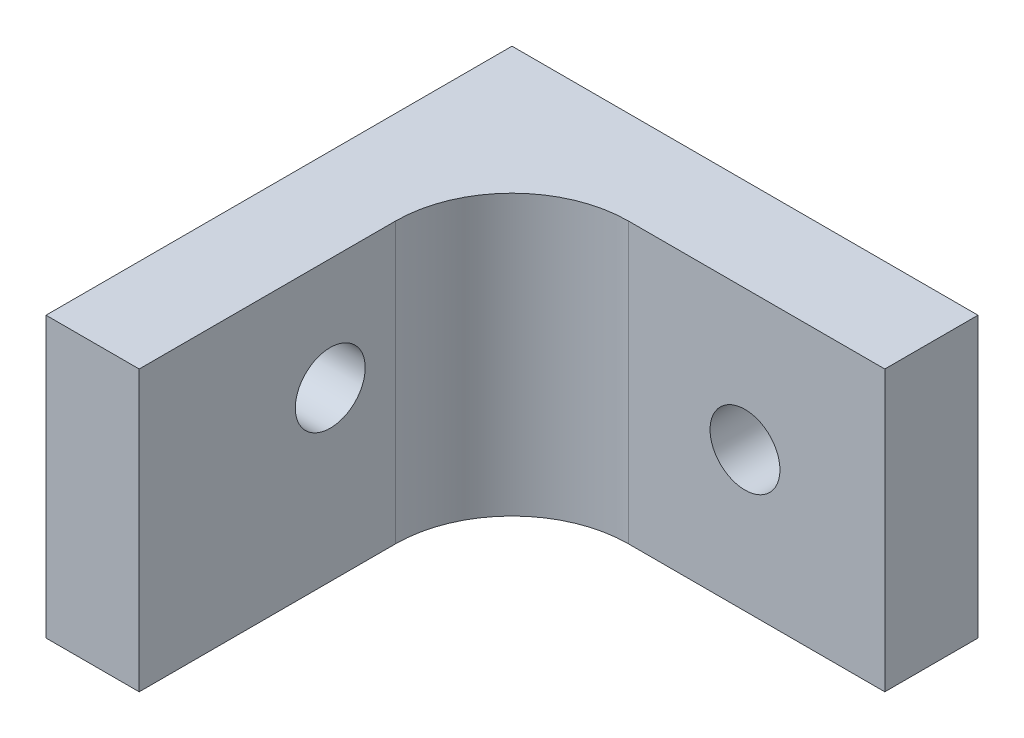
ISO-10303-21;
HEADER;
FILE_DESCRIPTION(('STEP AP214'),'2;1');
FILE_NAME('part.step','',(''),(''),'','','');
FILE_SCHEMA(('AUTOMOTIVE_DESIGN { 1 0 10303 214 1 1 1 1 }'));
ENDSEC;
DATA;
#1=APPLICATION_CONTEXT('core data for automotive mechanical design processes');
#2=APPLICATION_PROTOCOL_DEFINITION('international standard','automotive_design',2000,#1);
#3=PRODUCT_CONTEXT('',#1,'mechanical');
#4=PRODUCT('Part','Part','',(#3));
#5=PRODUCT_RELATED_PRODUCT_CATEGORY('part','',(#4));
#6=PRODUCT_DEFINITION_FORMATION('','',#4);
#7=PRODUCT_DEFINITION_CONTEXT('part definition',#1,'design');
#8=PRODUCT_DEFINITION('design','',#6,#7);
#9=PRODUCT_DEFINITION_SHAPE('','',#8);
#10=(LENGTH_UNIT() NAMED_UNIT(*) SI_UNIT(.MILLI.,.METRE.));
#11=(NAMED_UNIT(*) PLANE_ANGLE_UNIT() SI_UNIT($,.RADIAN.));
#12=(NAMED_UNIT(*) SI_UNIT($,.STERADIAN.) SOLID_ANGLE_UNIT());
#13=UNCERTAINTY_MEASURE_WITH_UNIT(LENGTH_MEASURE(1.E-05),#10,'distance_accuracy_value','');
#14=(GEOMETRIC_REPRESENTATION_CONTEXT(3) GLOBAL_UNCERTAINTY_ASSIGNED_CONTEXT((#13)) GLOBAL_UNIT_ASSIGNED_CONTEXT((#10,
#11,#12)) REPRESENTATION_CONTEXT('',''));
#15=CARTESIAN_POINT('',(0.,0.,0.));
#16=DIRECTION('',(0.,0.,1.));
#17=DIRECTION('',(1.,0.,0.));
#18=AXIS2_PLACEMENT_3D('',#15,#16,#17);
#19=CARTESIAN_POINT('',(0.,0.,2.));
#20=DIRECTION('',(0.,0.,1.));
#21=DIRECTION('',(1.,0.,0.));
#22=AXIS2_PLACEMENT_3D('',#19,#20,#21);
#23=PLANE('',#22);
#24=CARTESIAN_POINT('',(-3.,-3.,2.));
#25=DIRECTION('',(0.,0.,1.));
#26=DIRECTION('',(1.,0.,0.));
#27=AXIS2_PLACEMENT_3D('',#24,#25,#26);
#28=CIRCLE('',#27,0.75);
#29=CARTESIAN_POINT('',(-2.25,-3.,2.));
#30=VERTEX_POINT('',#29);
#31=EDGE_CURVE('E124',#30,#30,#28,.T.);
#32=ORIENTED_EDGE('',*,*,#31,.F.);
#33=EDGE_LOOP('',(#32));
#34=FACE_BOUND('',#33,.T.);
#35=DIRECTION('',(-1.,0.,0.));
#36=VECTOR('',#35,1.);
#37=CARTESIAN_POINT('',(0.,0.,2.));
#38=LINE('',#37,#36);
#39=CARTESIAN_POINT('',(0.,0.,2.));
#40=VERTEX_POINT('',#39);
#41=CARTESIAN_POINT('',(-5.5,0.,2.));
#42=VERTEX_POINT('',#41);
#43=EDGE_CURVE('E135',#40,#42,#38,.T.);
#44=ORIENTED_EDGE('',*,*,#43,.T.);
#45=DIRECTION('',(0.,-1.,0.));
#46=VECTOR('',#45,1.);
#47=CARTESIAN_POINT('',(-5.5,0.,2.));
#48=LINE('',#47,#46);
#49=CARTESIAN_POINT('',(-5.5,-6.00000000000001,2.));
#50=VERTEX_POINT('',#49);
#51=EDGE_CURVE('E158',#42,#50,#48,.T.);
#52=ORIENTED_EDGE('',*,*,#51,.T.);
#53=DIRECTION('',(1.,0.,0.));
#54=VECTOR('',#53,1.);
#55=CARTESIAN_POINT('',(0.,-6.00000000000001,2.));
#56=LINE('',#55,#54);
#57=CARTESIAN_POINT('',(0.,-6.00000000000001,2.));
#58=VERTEX_POINT('',#57);
#59=EDGE_CURVE('E138',#50,#58,#56,.T.);
#60=ORIENTED_EDGE('',*,*,#59,.T.);
#61=DIRECTION('',(0.,1.,0.));
#62=VECTOR('',#61,1.);
#63=CARTESIAN_POINT('',(0.,-6.00000000000001,2.));
#64=LINE('',#63,#62);
#65=EDGE_CURVE('E126',#58,#40,#64,.T.);
#66=ORIENTED_EDGE('',*,*,#65,.T.);
#67=EDGE_LOOP('',(#44,#52,#60,#66));
#68=FACE_BOUND('',#67,.T.);
#69=ADVANCED_FACE('F39',(#34,#68),#23,.T.);
#70=CARTESIAN_POINT('',(0.,0.,0.));
#71=DIRECTION('',(0.,0.,1.));
#72=DIRECTION('',(1.,0.,0.));
#73=AXIS2_PLACEMENT_3D('',#70,#71,#72);
#74=PLANE('',#73);
#75=DIRECTION('',(0.,-1.,0.));
#76=VECTOR('',#75,1.);
#77=CARTESIAN_POINT('',(-10.,-6.00000000000001,0.));
#78=LINE('',#77,#76);
#79=CARTESIAN_POINT('',(-10.,0.,0.));
#80=VERTEX_POINT('',#79);
#81=CARTESIAN_POINT('',(-10.,-6.00000000000001,0.));
#82=VERTEX_POINT('',#81);
#83=EDGE_CURVE('E141',#80,#82,#78,.T.);
#84=ORIENTED_EDGE('',*,*,#83,.F.);
#85=DIRECTION('',(-1.,0.,0.));
#86=VECTOR('',#85,1.);
#87=CARTESIAN_POINT('',(0.,0.,0.));
#88=LINE('',#87,#86);
#89=CARTESIAN_POINT('',(0.,0.,0.));
#90=VERTEX_POINT('',#89);
#91=EDGE_CURVE('E142',#90,#80,#88,.T.);
#92=ORIENTED_EDGE('',*,*,#91,.F.);
#93=DIRECTION('',(0.,1.,0.));
#94=VECTOR('',#93,1.);
#95=CARTESIAN_POINT('',(0.,-6.00000000000001,0.));
#96=LINE('',#95,#94);
#97=CARTESIAN_POINT('',(0.,-6.00000000000001,0.));
#98=VERTEX_POINT('',#97);
#99=EDGE_CURVE('E127',#98,#90,#96,.T.);
#100=ORIENTED_EDGE('',*,*,#99,.F.);
#101=DIRECTION('',(1.,0.,0.));
#102=VECTOR('',#101,1.);
#103=CARTESIAN_POINT('',(0.,-6.00000000000001,0.));
#104=LINE('',#103,#102);
#105=EDGE_CURVE('E134',#82,#98,#104,.T.);
#106=ORIENTED_EDGE('',*,*,#105,.F.);
#107=EDGE_LOOP('',(#84,#92,#100,#106));
#108=FACE_BOUND('',#107,.T.);
#109=CARTESIAN_POINT('',(-3.,-3.,0.));
#110=DIRECTION('',(0.,0.,1.));
#111=DIRECTION('',(1.,0.,0.));
#112=AXIS2_PLACEMENT_3D('',#109,#110,#111);
#113=CIRCLE('',#112,0.75);
#114=CARTESIAN_POINT('',(-2.25,-3.,0.));
#115=VERTEX_POINT('',#114);
#116=EDGE_CURVE('E122',#115,#115,#113,.T.);
#117=ORIENTED_EDGE('',*,*,#116,.T.);
#118=EDGE_LOOP('',(#117));
#119=FACE_BOUND('',#118,.T.);
#120=ADVANCED_FACE('F181',(#108,#119),#74,.F.);
#121=CARTESIAN_POINT('',(0.,-6.00000000000001,2.));
#122=DIRECTION('',(-1.,0.,0.));
#123=DIRECTION('',(0.,-1.,0.));
#124=AXIS2_PLACEMENT_3D('',#121,#122,#123);
#125=PLANE('',#124);
#126=ORIENTED_EDGE('',*,*,#99,.T.);
#127=DIRECTION('',(0.,0.,-1.));
#128=VECTOR('',#127,1.);
#129=CARTESIAN_POINT('',(0.,0.,2.));
#130=LINE('',#129,#128);
#131=EDGE_CURVE('E154',#40,#90,#130,.T.);
#132=ORIENTED_EDGE('',*,*,#131,.F.);
#133=ORIENTED_EDGE('',*,*,#65,.F.);
#134=DIRECTION('',(0.,0.,-1.));
#135=VECTOR('',#134,1.);
#136=CARTESIAN_POINT('',(0.,-6.00000000000001,2.));
#137=LINE('',#136,#135);
#138=EDGE_CURVE('E137',#58,#98,#137,.T.);
#139=ORIENTED_EDGE('',*,*,#138,.T.);
#140=EDGE_LOOP('',(#126,#132,#133,#139));
#141=FACE_BOUND('',#140,.T.);
#142=ADVANCED_FACE('F169',(#141),#125,.F.);
#143=CARTESIAN_POINT('',(0.,0.,2.));
#144=DIRECTION('',(0.,-1.,0.));
#145=DIRECTION('',(0.,0.,-1.));
#146=AXIS2_PLACEMENT_3D('',#143,#144,#145);
#147=PLANE('',#146);
#148=DIRECTION('',(0.,0.,-1.));
#149=VECTOR('',#148,1.);
#150=CARTESIAN_POINT('',(-10.,0.,2.));
#151=LINE('',#150,#149);
#152=CARTESIAN_POINT('',(-10.,0.,10.));
#153=VERTEX_POINT('',#152);
#154=EDGE_CURVE('E148',#153,#80,#151,.T.);
#155=ORIENTED_EDGE('',*,*,#154,.F.);
#156=DIRECTION('',(-1.,0.,0.));
#157=VECTOR('',#156,1.);
#158=CARTESIAN_POINT('',(-8.,0.,10.));
#159=LINE('',#158,#157);
#160=CARTESIAN_POINT('',(-8.,0.,10.));
#161=VERTEX_POINT('',#160);
#162=EDGE_CURVE('E109',#161,#153,#159,.T.);
#163=ORIENTED_EDGE('',*,*,#162,.F.);
#164=DIRECTION('',(0.,0.,-1.));
#165=VECTOR('',#164,1.);
#166=CARTESIAN_POINT('',(-8.,0.,0.));
#167=LINE('',#166,#165);
#168=CARTESIAN_POINT('',(-8.,0.,4.5));
#169=VERTEX_POINT('',#168);
#170=EDGE_CURVE('E111',#161,#169,#167,.T.);
#171=ORIENTED_EDGE('',*,*,#170,.T.);
#172=CARTESIAN_POINT('',(-5.5,0.,4.5));
#173=DIRECTION('',(0.,-1.,0.));
#174=DIRECTION('',(0.,0.,-1.));
#175=AXIS2_PLACEMENT_3D('',#172,#173,#174);
#176=CIRCLE('',#175,2.5);
#177=EDGE_CURVE('E11',#169,#42,#176,.T.);
#178=ORIENTED_EDGE('',*,*,#177,.T.);
#179=ORIENTED_EDGE('',*,*,#43,.F.);
#180=ORIENTED_EDGE('',*,*,#131,.T.);
#181=ORIENTED_EDGE('',*,*,#91,.T.);
#182=EDGE_LOOP('',(#155,#163,#171,#178,#179,#180,#181));
#183=FACE_BOUND('',#182,.T.);
#184=ADVANCED_FACE('F171',(#183),#147,.F.);
#185=CARTESIAN_POINT('',(-10.,-6.00000000000001,2.));
#186=DIRECTION('',(1.,0.,0.));
#187=DIRECTION('',(0.,0.,-1.));
#188=AXIS2_PLACEMENT_3D('',#185,#186,#187);
#189=PLANE('',#188);
#190=ORIENTED_EDGE('',*,*,#83,.T.);
#191=DIRECTION('',(0.,0.,-1.));
#192=VECTOR('',#191,1.);
#193=CARTESIAN_POINT('',(-10.,-6.00000000000001,2.));
#194=LINE('',#193,#192);
#195=CARTESIAN_POINT('',(-10.,-6.,10.));
#196=VERTEX_POINT('',#195);
#197=EDGE_CURVE('E149',#196,#82,#194,.T.);
#198=ORIENTED_EDGE('',*,*,#197,.F.);
#199=DIRECTION('',(0.,1.,0.));
#200=VECTOR('',#199,1.);
#201=CARTESIAN_POINT('',(-10.,0.,10.));
#202=LINE('',#201,#200);
#203=EDGE_CURVE('E101',#196,#153,#202,.T.);
#204=ORIENTED_EDGE('',*,*,#203,.T.);
#205=ORIENTED_EDGE('',*,*,#154,.T.);
#206=EDGE_LOOP('',(#190,#198,#204,#205));
#207=FACE_BOUND('',#206,.T.);
#208=CARTESIAN_POINT('',(-10.,-2.4,5.90000000000007));
#209=DIRECTION('',(-1.,0.,0.));
#210=DIRECTION('',(0.,0.,1.));
#211=AXIS2_PLACEMENT_3D('',#208,#209,#210);
#212=CIRCLE('',#211,0.75);
#213=CARTESIAN_POINT('',(-10.,-2.4,6.65000000000007));
#214=VERTEX_POINT('',#213);
#215=EDGE_CURVE('E281',#214,#214,#212,.T.);
#216=ORIENTED_EDGE('',*,*,#215,.F.);
#217=EDGE_LOOP('',(#216));
#218=FACE_BOUND('',#217,.T.);
#219=ADVANCED_FACE('F200',(#207,#218),#189,.F.);
#220=CARTESIAN_POINT('',(0.,-6.00000000000001,2.));
#221=DIRECTION('',(0.,1.,0.));
#222=DIRECTION('',(0.,0.,1.));
#223=AXIS2_PLACEMENT_3D('',#220,#221,#222);
#224=PLANE('',#223);
#225=ORIENTED_EDGE('',*,*,#105,.T.);
#226=ORIENTED_EDGE('',*,*,#138,.F.);
#227=ORIENTED_EDGE('',*,*,#59,.F.);
#228=CARTESIAN_POINT('',(-5.5,-6.00000000000001,4.5));
#229=DIRECTION('',(0.,1.,0.));
#230=DIRECTION('',(0.,0.,1.));
#231=AXIS2_PLACEMENT_3D('',#228,#229,#230);
#232=CIRCLE('',#231,2.5);
#233=CARTESIAN_POINT('',(-8.,-6.,4.5));
#234=VERTEX_POINT('',#233);
#235=EDGE_CURVE('E50',#50,#234,#232,.T.);
#236=ORIENTED_EDGE('',*,*,#235,.T.);
#237=DIRECTION('',(0.,0.,1.));
#238=VECTOR('',#237,1.);
#239=CARTESIAN_POINT('',(-8.,-6.,0.));
#240=LINE('',#239,#238);
#241=CARTESIAN_POINT('',(-8.,-6.,10.));
#242=VERTEX_POINT('',#241);
#243=EDGE_CURVE('E91',#234,#242,#240,.T.);
#244=ORIENTED_EDGE('',*,*,#243,.T.);
#245=DIRECTION('',(-1.,0.,0.));
#246=VECTOR('',#245,1.);
#247=CARTESIAN_POINT('',(-8.,-6.,10.));
#248=LINE('',#247,#246);
#249=EDGE_CURVE('E100',#242,#196,#248,.T.);
#250=ORIENTED_EDGE('',*,*,#249,.T.);
#251=ORIENTED_EDGE('',*,*,#197,.T.);
#252=EDGE_LOOP('',(#225,#226,#227,#236,#244,#250,#251));
#253=FACE_BOUND('',#252,.T.);
#254=ADVANCED_FACE('F97',(#253),#224,.F.);
#255=CARTESIAN_POINT('',(-3.,-3.,2.));
#256=DIRECTION('',(0.,0.,-1.));
#257=DIRECTION('',(-1.,0.,0.));
#258=AXIS2_PLACEMENT_3D('',#255,#256,#257);
#259=CYLINDRICAL_SURFACE('',#258,0.75);
#260=ORIENTED_EDGE('',*,*,#31,.T.);
#261=EDGE_LOOP('',(#260));
#262=FACE_BOUND('',#261,.T.);
#263=ORIENTED_EDGE('',*,*,#116,.F.);
#264=EDGE_LOOP('',(#263));
#265=FACE_BOUND('',#264,.T.);
#266=ADVANCED_FACE('F195',(#262,#265),#259,.F.);
#267=CARTESIAN_POINT('',(-8.,0.,10.));
#268=DIRECTION('',(0.,0.,1.));
#269=DIRECTION('',(1.,0.,0.));
#270=AXIS2_PLACEMENT_3D('',#267,#268,#269);
#271=PLANE('',#270);
#272=ORIENTED_EDGE('',*,*,#203,.F.);
#273=ORIENTED_EDGE('',*,*,#249,.F.);
#274=DIRECTION('',(0.,1.,0.));
#275=VECTOR('',#274,1.);
#276=CARTESIAN_POINT('',(-8.,0.,10.));
#277=LINE('',#276,#275);
#278=EDGE_CURVE('E105',#242,#161,#277,.T.);
#279=ORIENTED_EDGE('',*,*,#278,.T.);
#280=ORIENTED_EDGE('',*,*,#162,.T.);
#281=EDGE_LOOP('',(#272,#273,#279,#280));
#282=FACE_BOUND('',#281,.T.);
#283=ADVANCED_FACE('F110',(#282),#271,.T.);
#284=CARTESIAN_POINT('',(-8.,0.,0.));
#285=DIRECTION('',(-1.,0.,0.));
#286=DIRECTION('',(0.,0.,1.));
#287=AXIS2_PLACEMENT_3D('',#284,#285,#286);
#288=PLANE('',#287);
#289=ORIENTED_EDGE('',*,*,#243,.F.);
#290=DIRECTION('',(0.,-1.,0.));
#291=VECTOR('',#290,1.);
#292=CARTESIAN_POINT('',(-8.,0.,4.5));
#293=LINE('',#292,#291);
#294=EDGE_CURVE('E58',#234,#169,#293,.F.);
#295=ORIENTED_EDGE('',*,*,#294,.T.);
#296=ORIENTED_EDGE('',*,*,#170,.F.);
#297=ORIENTED_EDGE('',*,*,#278,.F.);
#298=EDGE_LOOP('',(#289,#295,#296,#297));
#299=FACE_BOUND('',#298,.T.);
#300=CARTESIAN_POINT('',(-8.,-2.4,5.90000000000007));
#301=DIRECTION('',(-1.,0.,0.));
#302=DIRECTION('',(0.,0.,1.));
#303=AXIS2_PLACEMENT_3D('',#300,#301,#302);
#304=CIRCLE('',#303,0.75);
#305=CARTESIAN_POINT('',(-8.,-2.4,6.65000000000007));
#306=VERTEX_POINT('',#305);
#307=EDGE_CURVE('E119',#306,#306,#304,.T.);
#308=ORIENTED_EDGE('',*,*,#307,.T.);
#309=EDGE_LOOP('',(#308));
#310=FACE_BOUND('',#309,.T.);
#311=ADVANCED_FACE('F113',(#299,#310),#288,.F.);
#312=CARTESIAN_POINT('',(-8.,-2.4,5.90000000000007));
#313=DIRECTION('',(-1.,0.,0.));
#314=DIRECTION('',(0.,0.,1.));
#315=AXIS2_PLACEMENT_3D('',#312,#313,#314);
#316=CYLINDRICAL_SURFACE('',#315,0.75);
#317=ORIENTED_EDGE('',*,*,#307,.F.);
#318=EDGE_LOOP('',(#317));
#319=FACE_BOUND('',#318,.T.);
#320=ORIENTED_EDGE('',*,*,#215,.T.);
#321=EDGE_LOOP('',(#320));
#322=FACE_BOUND('',#321,.T.);
#323=ADVANCED_FACE('F173',(#319,#322),#316,.F.);
#324=CARTESIAN_POINT('',(-5.5,0.,4.5));
#325=DIRECTION('',(0.,-1.,0.));
#326=DIRECTION('',(0.,0.,-1.));
#327=AXIS2_PLACEMENT_3D('',#324,#325,#326);
#328=CYLINDRICAL_SURFACE('',#327,2.5);
#329=ORIENTED_EDGE('',*,*,#177,.F.);
#330=ORIENTED_EDGE('',*,*,#294,.F.);
#331=ORIENTED_EDGE('',*,*,#235,.F.);
#332=ORIENTED_EDGE('',*,*,#51,.F.);
#333=EDGE_LOOP('',(#329,#330,#331,#332));
#334=FACE_BOUND('',#333,.T.);
#335=ADVANCED_FACE('F41',(#334),#328,.F.);
#336=CLOSED_SHELL('',(#69,#120,#142,#184,#219,#254,#266,#283,#311,#323,#335));
#337=MANIFOLD_SOLID_BREP('B2',#336);
#338=ADVANCED_BREP_SHAPE_REPRESENTATION('',(#18,#337),#14);
#339=SHAPE_DEFINITION_REPRESENTATION(#9,#338);
ENDSEC;
END-ISO-10303-21;
